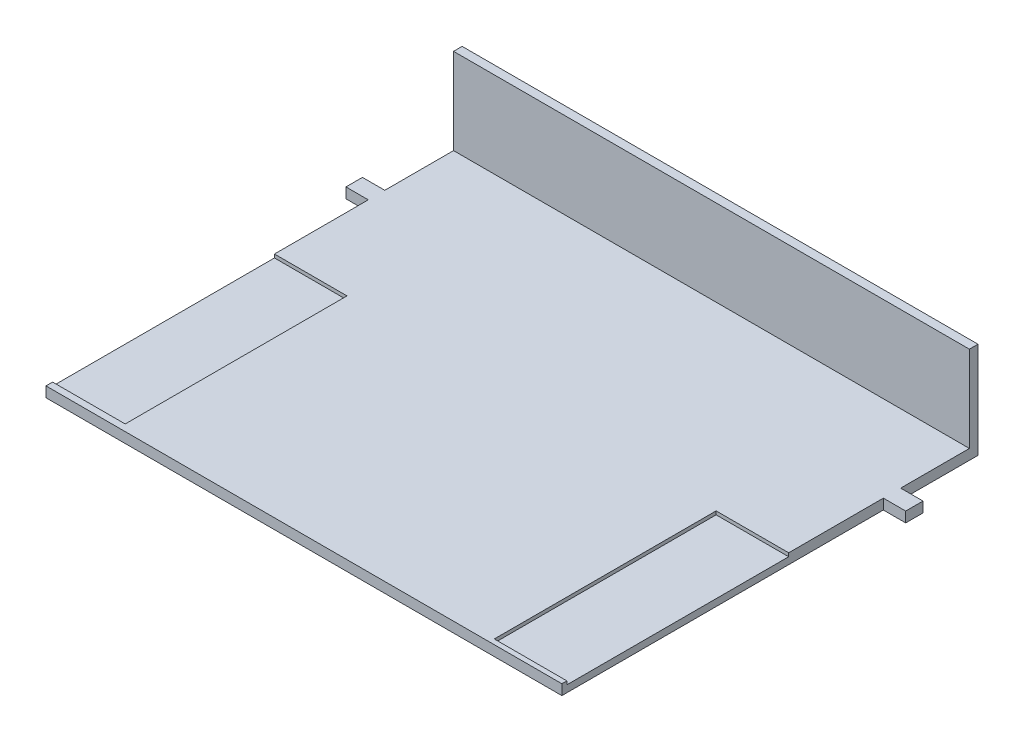
ISO-10303-21;
HEADER;
FILE_DESCRIPTION(('STEP AP214'),'2;1');
FILE_NAME('part.step','',(''),(''),'','','');
FILE_SCHEMA(('AUTOMOTIVE_DESIGN { 1 0 10303 214 1 1 1 1 }'));
ENDSEC;
DATA;
#1=APPLICATION_CONTEXT('core data for automotive mechanical design processes');
#2=APPLICATION_PROTOCOL_DEFINITION('international standard','automotive_design',2000,#1);
#3=PRODUCT_CONTEXT('',#1,'mechanical');
#4=PRODUCT('Part','Part','',(#3));
#5=PRODUCT_RELATED_PRODUCT_CATEGORY('part','',(#4));
#6=PRODUCT_DEFINITION_FORMATION('','',#4);
#7=PRODUCT_DEFINITION_CONTEXT('part definition',#1,'design');
#8=PRODUCT_DEFINITION('design','',#6,#7);
#9=PRODUCT_DEFINITION_SHAPE('','',#8);
#10=(LENGTH_UNIT() NAMED_UNIT(*) SI_UNIT(.MILLI.,.METRE.));
#11=(NAMED_UNIT(*) PLANE_ANGLE_UNIT() SI_UNIT($,.RADIAN.));
#12=(NAMED_UNIT(*) SI_UNIT($,.STERADIAN.) SOLID_ANGLE_UNIT());
#13=UNCERTAINTY_MEASURE_WITH_UNIT(LENGTH_MEASURE(1.E-05),#10,'distance_accuracy_value','');
#14=(GEOMETRIC_REPRESENTATION_CONTEXT(3) GLOBAL_UNCERTAINTY_ASSIGNED_CONTEXT((#13)) GLOBAL_UNIT_ASSIGNED_CONTEXT((#10,
#11,#12)) REPRESENTATION_CONTEXT('',''));
#15=CARTESIAN_POINT('',(0.,0.,0.));
#16=DIRECTION('',(0.,0.,1.));
#17=DIRECTION('',(1.,0.,0.));
#18=AXIS2_PLACEMENT_3D('',#15,#16,#17);
#19=CARTESIAN_POINT('',(0.,3.,121.));
#20=DIRECTION('',(0.,1.,0.));
#21=DIRECTION('',(0.,0.,1.));
#22=AXIS2_PLACEMENT_3D('',#19,#20,#21);
#23=PLANE('',#22);
#24=DIRECTION('',(0.,0.,-1.));
#25=VECTOR('',#24,1.);
#26=CARTESIAN_POINT('',(150.,3.,121.));
#27=LINE('',#26,#25);
#28=CARTESIAN_POINT('',(150.,3.,22.4873306391878));
#29=VERTEX_POINT('',#28);
#30=CARTESIAN_POINT('',(150.,3.,2.5));
#31=VERTEX_POINT('',#30);
#32=EDGE_CURVE('E326',#29,#31,#27,.T.);
#33=ORIENTED_EDGE('',*,*,#32,.T.);
#34=DIRECTION('',(-1.,0.,0.));
#35=VECTOR('',#34,1.);
#36=CARTESIAN_POINT('',(150.,3.,2.5));
#37=LINE('',#36,#35);
#38=CARTESIAN_POINT('',(0.,3.,2.5));
#39=VERTEX_POINT('',#38);
#40=EDGE_CURVE('E205',#31,#39,#37,.T.);
#41=ORIENTED_EDGE('',*,*,#40,.T.);
#42=DIRECTION('',(0.,0.,-1.));
#43=VECTOR('',#42,1.);
#44=CARTESIAN_POINT('',(0.,3.,121.));
#45=LINE('',#44,#43);
#46=CARTESIAN_POINT('',(0.,3.,22.4873306391878));
#47=VERTEX_POINT('',#46);
#48=EDGE_CURVE('E43',#47,#39,#45,.T.);
#49=ORIENTED_EDGE('',*,*,#48,.F.);
#50=DIRECTION('',(-1.,0.,0.));
#51=VECTOR('',#50,1.);
#52=CARTESIAN_POINT('',(0.,3.,22.4873306391878));
#53=LINE('',#52,#51);
#54=CARTESIAN_POINT('',(-6.5,3.,22.4873306391878));
#55=VERTEX_POINT('',#54);
#56=EDGE_CURVE('E238',#47,#55,#53,.T.);
#57=ORIENTED_EDGE('',*,*,#56,.T.);
#58=DIRECTION('',(0.,0.,1.));
#59=VECTOR('',#58,1.);
#60=CARTESIAN_POINT('',(-6.5,3.,22.4873306391878));
#61=LINE('',#60,#59);
#62=CARTESIAN_POINT('',(-6.5,3.,27.2873306391878));
#63=VERTEX_POINT('',#62);
#64=EDGE_CURVE('E241',#55,#63,#61,.T.);
#65=ORIENTED_EDGE('',*,*,#64,.T.);
#66=DIRECTION('',(1.,0.,0.));
#67=VECTOR('',#66,1.);
#68=CARTESIAN_POINT('',(-6.5,3.,27.2873306391878));
#69=LINE('',#68,#67);
#70=CARTESIAN_POINT('',(0.,3.,27.2873306391878));
#71=VERTEX_POINT('',#70);
#72=EDGE_CURVE('E236',#63,#71,#69,.T.);
#73=ORIENTED_EDGE('',*,*,#72,.T.);
#74=CARTESIAN_POINT('',(0.,3.,54.5746612783755));
#75=VERTEX_POINT('',#74);
#76=EDGE_CURVE('E41',#75,#71,#45,.T.);
#77=ORIENTED_EDGE('',*,*,#76,.F.);
#78=DIRECTION('',(-1.,0.,0.));
#79=VECTOR('',#78,1.);
#80=CARTESIAN_POINT('',(21.1,3.,54.5746612783755));
#81=LINE('',#80,#79);
#82=CARTESIAN_POINT('',(21.1,3.,54.5746612783755));
#83=VERTEX_POINT('',#82);
#84=EDGE_CURVE('E281',#83,#75,#81,.T.);
#85=ORIENTED_EDGE('',*,*,#84,.F.);
#86=DIRECTION('',(0.,0.,-1.));
#87=VECTOR('',#86,1.);
#88=CARTESIAN_POINT('',(21.1,3.,119.074661278376));
#89=LINE('',#88,#87);
#90=CARTESIAN_POINT('',(21.1,3.,119.074661278376));
#91=VERTEX_POINT('',#90);
#92=EDGE_CURVE('E290',#91,#83,#89,.T.);
#93=ORIENTED_EDGE('',*,*,#92,.F.);
#94=DIRECTION('',(1.,0.,0.));
#95=VECTOR('',#94,1.);
#96=CARTESIAN_POINT('',(0.,3.,119.074661278376));
#97=LINE('',#96,#95);
#98=CARTESIAN_POINT('',(0.,3.,119.074661278376));
#99=VERTEX_POINT('',#98);
#100=EDGE_CURVE('E301',#99,#91,#97,.T.);
#101=ORIENTED_EDGE('',*,*,#100,.F.);
#102=CARTESIAN_POINT('',(0.,3.,121.));
#103=VERTEX_POINT('',#102);
#104=EDGE_CURVE('E11',#103,#99,#45,.T.);
#105=ORIENTED_EDGE('',*,*,#104,.F.);
#106=DIRECTION('',(1.,0.,0.));
#107=VECTOR('',#106,1.);
#108=CARTESIAN_POINT('',(0.,3.,121.));
#109=LINE('',#108,#107);
#110=CARTESIAN_POINT('',(150.,3.,121.));
#111=VERTEX_POINT('',#110);
#112=EDGE_CURVE('E315',#103,#111,#109,.T.);
#113=ORIENTED_EDGE('',*,*,#112,.T.);
#114=CARTESIAN_POINT('',(150.,3.,119.548299377698));
#115=VERTEX_POINT('',#114);
#116=EDGE_CURVE('E36',#111,#115,#27,.T.);
#117=ORIENTED_EDGE('',*,*,#116,.T.);
#118=DIRECTION('',(1.,0.,0.));
#119=VECTOR('',#118,1.);
#120=CARTESIAN_POINT('',(150.,3.,119.548299377698));
#121=LINE('',#120,#119);
#122=CARTESIAN_POINT('',(128.9,3.,119.548299377698));
#123=VERTEX_POINT('',#122);
#124=EDGE_CURVE('E263',#123,#115,#121,.T.);
#125=ORIENTED_EDGE('',*,*,#124,.F.);
#126=DIRECTION('',(0.,0.,1.));
#127=VECTOR('',#126,1.);
#128=CARTESIAN_POINT('',(128.9,3.,119.548299377698));
#129=LINE('',#128,#127);
#130=CARTESIAN_POINT('',(128.9,3.,55.0482993776977));
#131=VERTEX_POINT('',#130);
#132=EDGE_CURVE('E274',#131,#123,#129,.T.);
#133=ORIENTED_EDGE('',*,*,#132,.F.);
#134=DIRECTION('',(-1.,0.,0.));
#135=VECTOR('',#134,1.);
#136=CARTESIAN_POINT('',(128.9,3.,55.0482993776977));
#137=LINE('',#136,#135);
#138=CARTESIAN_POINT('',(150.,3.,55.0482993776977));
#139=VERTEX_POINT('',#138);
#140=EDGE_CURVE('E258',#139,#131,#137,.T.);
#141=ORIENTED_EDGE('',*,*,#140,.F.);
#142=CARTESIAN_POINT('',(150.,3.,27.5241496888489));
#143=VERTEX_POINT('',#142);
#144=EDGE_CURVE('E345',#139,#143,#27,.T.);
#145=ORIENTED_EDGE('',*,*,#144,.T.);
#146=DIRECTION('',(1.,0.,0.));
#147=VECTOR('',#146,1.);
#148=CARTESIAN_POINT('',(150.,3.,27.5241496888489));
#149=LINE('',#148,#147);
#150=CARTESIAN_POINT('',(156.5,3.,27.5241496888489));
#151=VERTEX_POINT('',#150);
#152=EDGE_CURVE('E58',#143,#151,#149,.T.);
#153=ORIENTED_EDGE('',*,*,#152,.T.);
#154=DIRECTION('',(0.,0.,-1.));
#155=VECTOR('',#154,1.);
#156=CARTESIAN_POINT('',(156.5,3.,27.5241496888489));
#157=LINE('',#156,#155);
#158=CARTESIAN_POINT('',(156.5,3.,22.4873306391878));
#159=VERTEX_POINT('',#158);
#160=EDGE_CURVE('E216',#151,#159,#157,.T.);
#161=ORIENTED_EDGE('',*,*,#160,.T.);
#162=DIRECTION('',(-1.,0.,0.));
#163=VECTOR('',#162,1.);
#164=CARTESIAN_POINT('',(156.5,3.,22.4873306391878));
#165=LINE('',#164,#163);
#166=EDGE_CURVE('E211',#159,#29,#165,.T.);
#167=ORIENTED_EDGE('',*,*,#166,.T.);
#168=EDGE_LOOP('',(#33,#41,#49,#57,#65,#73,#77,#85,#93,#101,#105,#113,#117,#125,#133,#141,#145,
#153,#161,#167));
#169=FACE_BOUND('',#168,.T.);
#170=ADVANCED_FACE('F33',(#169),#23,.T.);
#171=CARTESIAN_POINT('',(150.,0.,121.));
#172=DIRECTION('',(-1.,0.,0.));
#173=DIRECTION('',(0.,0.,1.));
#174=AXIS2_PLACEMENT_3D('',#171,#172,#173);
#175=PLANE('',#174);
#176=DIRECTION('',(0.,1.,0.));
#177=VECTOR('',#176,1.);
#178=CARTESIAN_POINT('',(150.,0.,22.4873306391878));
#179=LINE('',#178,#177);
#180=CARTESIAN_POINT('',(150.,0.,22.4873306391878));
#181=VERTEX_POINT('',#180);
#182=EDGE_CURVE('E222',#181,#29,#179,.T.);
#183=ORIENTED_EDGE('',*,*,#182,.F.);
#184=DIRECTION('',(0.,0.,-1.));
#185=VECTOR('',#184,1.);
#186=CARTESIAN_POINT('',(150.,0.,121.));
#187=LINE('',#186,#185);
#188=CARTESIAN_POINT('',(150.,0.,0.));
#189=VERTEX_POINT('',#188);
#190=EDGE_CURVE('E337',#181,#189,#187,.T.);
#191=ORIENTED_EDGE('',*,*,#190,.T.);
#192=DIRECTION('',(0.,1.,0.));
#193=VECTOR('',#192,1.);
#194=CARTESIAN_POINT('',(150.,0.,0.));
#195=LINE('',#194,#193);
#196=CARTESIAN_POINT('',(150.,28.,0.));
#197=VERTEX_POINT('',#196);
#198=EDGE_CURVE('E308',#189,#197,#195,.T.);
#199=ORIENTED_EDGE('',*,*,#198,.T.);
#200=DIRECTION('',(0.,0.,-1.));
#201=VECTOR('',#200,1.);
#202=CARTESIAN_POINT('',(150.,28.,2.5));
#203=LINE('',#202,#201);
#204=CARTESIAN_POINT('',(150.,28.,2.5));
#205=VERTEX_POINT('',#204);
#206=EDGE_CURVE('E195',#205,#197,#203,.T.);
#207=ORIENTED_EDGE('',*,*,#206,.F.);
#208=DIRECTION('',(0.,-1.,0.));
#209=VECTOR('',#208,1.);
#210=CARTESIAN_POINT('',(150.,3.,2.5));
#211=LINE('',#210,#209);
#212=EDGE_CURVE('E196',#205,#31,#211,.T.);
#213=ORIENTED_EDGE('',*,*,#212,.T.);
#214=ORIENTED_EDGE('',*,*,#32,.F.);
#215=EDGE_LOOP('',(#183,#191,#199,#207,#213,#214));
#216=FACE_BOUND('',#215,.T.);
#217=ADVANCED_FACE('F353',(#216),#175,.F.);
#218=CARTESIAN_POINT('',(0.,0.,121.));
#219=DIRECTION('',(-1.,0.,0.));
#220=DIRECTION('',(0.,0.,1.));
#221=AXIS2_PLACEMENT_3D('',#218,#219,#220);
#222=PLANE('',#221);
#223=ORIENTED_EDGE('',*,*,#76,.T.);
#224=DIRECTION('',(0.,-1.,0.));
#225=VECTOR('',#224,1.);
#226=CARTESIAN_POINT('',(0.,3.,27.2873306391878));
#227=LINE('',#226,#225);
#228=CARTESIAN_POINT('',(0.,0.,27.2873306391878));
#229=VERTEX_POINT('',#228);
#230=EDGE_CURVE('E255',#71,#229,#227,.T.);
#231=ORIENTED_EDGE('',*,*,#230,.T.);
#232=DIRECTION('',(0.,0.,-1.));
#233=VECTOR('',#232,1.);
#234=CARTESIAN_POINT('',(0.,0.,121.));
#235=LINE('',#234,#233);
#236=CARTESIAN_POINT('',(0.,0.,121.));
#237=VERTEX_POINT('',#236);
#238=EDGE_CURVE('E332',#237,#229,#235,.T.);
#239=ORIENTED_EDGE('',*,*,#238,.F.);
#240=DIRECTION('',(0.,1.,0.));
#241=VECTOR('',#240,1.);
#242=CARTESIAN_POINT('',(0.,0.,121.));
#243=LINE('',#242,#241);
#244=EDGE_CURVE('E323',#237,#103,#243,.T.);
#245=ORIENTED_EDGE('',*,*,#244,.T.);
#246=ORIENTED_EDGE('',*,*,#104,.T.);
#247=DIRECTION('',(0.,1.,0.));
#248=VECTOR('',#247,1.);
#249=CARTESIAN_POINT('',(0.,2.,119.074661278376));
#250=LINE('',#249,#248);
#251=CARTESIAN_POINT('',(0.,2.,119.074661278376));
#252=VERTEX_POINT('',#251);
#253=EDGE_CURVE('E311',#252,#99,#250,.T.);
#254=ORIENTED_EDGE('',*,*,#253,.F.);
#255=DIRECTION('',(0.,0.,1.));
#256=VECTOR('',#255,1.);
#257=CARTESIAN_POINT('',(0.,2.,54.5746612783755));
#258=LINE('',#257,#256);
#259=CARTESIAN_POINT('',(0.,2.,54.5746612783755));
#260=VERTEX_POINT('',#259);
#261=EDGE_CURVE('E289',#260,#252,#258,.T.);
#262=ORIENTED_EDGE('',*,*,#261,.F.);
#263=DIRECTION('',(0.,1.,0.));
#264=VECTOR('',#263,1.);
#265=CARTESIAN_POINT('',(0.,2.,54.5746612783755));
#266=LINE('',#265,#264);
#267=EDGE_CURVE('E299',#260,#75,#266,.T.);
#268=ORIENTED_EDGE('',*,*,#267,.T.);
#269=EDGE_LOOP('',(#223,#231,#239,#245,#246,#254,#262,#268));
#270=FACE_BOUND('',#269,.T.);
#271=ADVANCED_FACE('F376',(#270),#222,.T.);
#272=DIRECTION('',(0.,-1.,0.));
#273=VECTOR('',#272,1.);
#274=CARTESIAN_POINT('',(0.,3.,22.4873306391878));
#275=LINE('',#274,#273);
#276=CARTESIAN_POINT('',(0.,0.,22.4873306391878));
#277=VERTEX_POINT('',#276);
#278=EDGE_CURVE('E253',#47,#277,#275,.T.);
#279=ORIENTED_EDGE('',*,*,#278,.F.);
#280=ORIENTED_EDGE('',*,*,#48,.T.);
#281=DIRECTION('',(0.,1.,0.));
#282=VECTOR('',#281,1.);
#283=CARTESIAN_POINT('',(0.,28.,2.5));
#284=LINE('',#283,#282);
#285=CARTESIAN_POINT('',(0.,28.,2.5));
#286=VERTEX_POINT('',#285);
#287=EDGE_CURVE('E50',#39,#286,#284,.T.);
#288=ORIENTED_EDGE('',*,*,#287,.T.);
#289=DIRECTION('',(0.,0.,-1.));
#290=VECTOR('',#289,1.);
#291=CARTESIAN_POINT('',(0.,28.,2.5));
#292=LINE('',#291,#290);
#293=CARTESIAN_POINT('',(0.,28.,0.));
#294=VERTEX_POINT('',#293);
#295=EDGE_CURVE('E186',#286,#294,#292,.T.);
#296=ORIENTED_EDGE('',*,*,#295,.T.);
#297=DIRECTION('',(0.,1.,0.));
#298=VECTOR('',#297,1.);
#299=CARTESIAN_POINT('',(0.,0.,0.));
#300=LINE('',#299,#298);
#301=CARTESIAN_POINT('',(0.,0.,0.));
#302=VERTEX_POINT('',#301);
#303=EDGE_CURVE('E319',#302,#294,#300,.T.);
#304=ORIENTED_EDGE('',*,*,#303,.F.);
#305=EDGE_CURVE('E334',#277,#302,#235,.T.);
#306=ORIENTED_EDGE('',*,*,#305,.F.);
#307=EDGE_LOOP('',(#279,#280,#288,#296,#304,#306));
#308=FACE_BOUND('',#307,.T.);
#309=ADVANCED_FACE('F203',(#308),#222,.T.);
#310=CARTESIAN_POINT('',(0.,0.,121.));
#311=DIRECTION('',(0.,1.,0.));
#312=DIRECTION('',(0.,0.,1.));
#313=AXIS2_PLACEMENT_3D('',#310,#311,#312);
#314=PLANE('',#313);
#315=DIRECTION('',(1.,0.,0.));
#316=VECTOR('',#315,1.);
#317=CARTESIAN_POINT('',(0.,0.,0.));
#318=LINE('',#317,#316);
#319=EDGE_CURVE('E328',#302,#189,#318,.T.);
#320=ORIENTED_EDGE('',*,*,#319,.T.);
#321=ORIENTED_EDGE('',*,*,#190,.F.);
#322=DIRECTION('',(-1.,0.,0.));
#323=VECTOR('',#322,1.);
#324=CARTESIAN_POINT('',(156.5,0.,22.4873306391878));
#325=LINE('',#324,#323);
#326=CARTESIAN_POINT('',(156.5,0.,22.4873306391878));
#327=VERTEX_POINT('',#326);
#328=EDGE_CURVE('E213',#327,#181,#325,.T.);
#329=ORIENTED_EDGE('',*,*,#328,.F.);
#330=DIRECTION('',(0.,0.,-1.));
#331=VECTOR('',#330,1.);
#332=CARTESIAN_POINT('',(156.5,0.,27.5241496888489));
#333=LINE('',#332,#331);
#334=CARTESIAN_POINT('',(156.5,0.,27.5241496888489));
#335=VERTEX_POINT('',#334);
#336=EDGE_CURVE('E219',#335,#327,#333,.T.);
#337=ORIENTED_EDGE('',*,*,#336,.F.);
#338=DIRECTION('',(1.,0.,0.));
#339=VECTOR('',#338,1.);
#340=CARTESIAN_POINT('',(150.,0.,27.5241496888489));
#341=LINE('',#340,#339);
#342=CARTESIAN_POINT('',(150.,0.,27.5241496888489));
#343=VERTEX_POINT('',#342);
#344=EDGE_CURVE('E215',#343,#335,#341,.T.);
#345=ORIENTED_EDGE('',*,*,#344,.F.);
#346=CARTESIAN_POINT('',(150.,0.,121.));
#347=VERTEX_POINT('',#346);
#348=EDGE_CURVE('E335',#347,#343,#187,.T.);
#349=ORIENTED_EDGE('',*,*,#348,.F.);
#350=DIRECTION('',(1.,0.,0.));
#351=VECTOR('',#350,1.);
#352=CARTESIAN_POINT('',(0.,0.,121.));
#353=LINE('',#352,#351);
#354=EDGE_CURVE('E321',#237,#347,#353,.T.);
#355=ORIENTED_EDGE('',*,*,#354,.F.);
#356=ORIENTED_EDGE('',*,*,#238,.T.);
#357=DIRECTION('',(1.,0.,0.));
#358=VECTOR('',#357,1.);
#359=CARTESIAN_POINT('',(-6.5,0.,27.2873306391878));
#360=LINE('',#359,#358);
#361=CARTESIAN_POINT('',(-6.5,0.,27.2873306391878));
#362=VERTEX_POINT('',#361);
#363=EDGE_CURVE('E230',#362,#229,#360,.T.);
#364=ORIENTED_EDGE('',*,*,#363,.F.);
#365=DIRECTION('',(0.,0.,1.));
#366=VECTOR('',#365,1.);
#367=CARTESIAN_POINT('',(-6.5,0.,22.4873306391878));
#368=LINE('',#367,#366);
#369=CARTESIAN_POINT('',(-6.5,0.,22.4873306391878));
#370=VERTEX_POINT('',#369);
#371=EDGE_CURVE('E239',#370,#362,#368,.T.);
#372=ORIENTED_EDGE('',*,*,#371,.F.);
#373=DIRECTION('',(-1.,0.,0.));
#374=VECTOR('',#373,1.);
#375=CARTESIAN_POINT('',(0.,0.,22.4873306391878));
#376=LINE('',#375,#374);
#377=EDGE_CURVE('E245',#277,#370,#376,.T.);
#378=ORIENTED_EDGE('',*,*,#377,.F.);
#379=ORIENTED_EDGE('',*,*,#305,.T.);
#380=EDGE_LOOP('',(#320,#321,#329,#337,#345,#349,#355,#356,#364,#372,#378,#379));
#381=FACE_BOUND('',#380,.T.);
#382=ADVANCED_FACE('F361',(#381),#314,.F.);
#383=ORIENTED_EDGE('',*,*,#348,.T.);
#384=DIRECTION('',(0.,1.,0.));
#385=VECTOR('',#384,1.);
#386=CARTESIAN_POINT('',(150.,0.,27.5241496888489));
#387=LINE('',#386,#385);
#388=EDGE_CURVE('E233',#343,#143,#387,.T.);
#389=ORIENTED_EDGE('',*,*,#388,.T.);
#390=ORIENTED_EDGE('',*,*,#144,.F.);
#391=DIRECTION('',(0.,1.,0.));
#392=VECTOR('',#391,1.);
#393=CARTESIAN_POINT('',(150.,2.,55.0482993776977));
#394=LINE('',#393,#392);
#395=CARTESIAN_POINT('',(150.,2.,55.0482993776977));
#396=VERTEX_POINT('',#395);
#397=EDGE_CURVE('E271',#396,#139,#394,.T.);
#398=ORIENTED_EDGE('',*,*,#397,.F.);
#399=DIRECTION('',(0.,0.,-1.));
#400=VECTOR('',#399,1.);
#401=CARTESIAN_POINT('',(150.,2.,119.548299377698));
#402=LINE('',#401,#400);
#403=CARTESIAN_POINT('',(150.,2.,119.548299377698));
#404=VERTEX_POINT('',#403);
#405=EDGE_CURVE('E259',#404,#396,#402,.T.);
#406=ORIENTED_EDGE('',*,*,#405,.F.);
#407=DIRECTION('',(0.,1.,0.));
#408=VECTOR('',#407,1.);
#409=CARTESIAN_POINT('',(150.,2.,119.548299377698));
#410=LINE('',#409,#408);
#411=EDGE_CURVE('E278',#404,#115,#410,.T.);
#412=ORIENTED_EDGE('',*,*,#411,.T.);
#413=ORIENTED_EDGE('',*,*,#116,.F.);
#414=DIRECTION('',(0.,1.,0.));
#415=VECTOR('',#414,1.);
#416=CARTESIAN_POINT('',(150.,0.,121.));
#417=LINE('',#416,#415);
#418=EDGE_CURVE('E318',#347,#111,#417,.T.);
#419=ORIENTED_EDGE('',*,*,#418,.F.);
#420=EDGE_LOOP('',(#383,#389,#390,#398,#406,#412,#413,#419));
#421=FACE_BOUND('',#420,.T.);
#422=ADVANCED_FACE('F396',(#421),#175,.F.);
#423=CARTESIAN_POINT('',(0.,0.,121.));
#424=DIRECTION('',(0.,0.,1.));
#425=DIRECTION('',(1.,0.,0.));
#426=AXIS2_PLACEMENT_3D('',#423,#424,#425);
#427=PLANE('',#426);
#428=ORIENTED_EDGE('',*,*,#112,.F.);
#429=ORIENTED_EDGE('',*,*,#244,.F.);
#430=ORIENTED_EDGE('',*,*,#354,.T.);
#431=ORIENTED_EDGE('',*,*,#418,.T.);
#432=EDGE_LOOP('',(#428,#429,#430,#431));
#433=FACE_BOUND('',#432,.T.);
#434=ADVANCED_FACE('F395',(#433),#427,.T.);
#435=CARTESIAN_POINT('',(0.,0.,0.));
#436=DIRECTION('',(0.,0.,1.));
#437=DIRECTION('',(1.,0.,0.));
#438=AXIS2_PLACEMENT_3D('',#435,#436,#437);
#439=PLANE('',#438);
#440=ORIENTED_EDGE('',*,*,#303,.T.);
#441=DIRECTION('',(1.,0.,0.));
#442=VECTOR('',#441,1.);
#443=CARTESIAN_POINT('',(150.,28.,0.));
#444=LINE('',#443,#442);
#445=EDGE_CURVE('E192',#294,#197,#444,.T.);
#446=ORIENTED_EDGE('',*,*,#445,.T.);
#447=ORIENTED_EDGE('',*,*,#198,.F.);
#448=ORIENTED_EDGE('',*,*,#319,.F.);
#449=EDGE_LOOP('',(#440,#446,#447,#448));
#450=FACE_BOUND('',#449,.T.);
#451=ADVANCED_FACE('F356',(#450),#439,.F.);
#452=CARTESIAN_POINT('',(21.1,2.,54.5746612783755));
#453=DIRECTION('',(0.,0.,-1.));
#454=DIRECTION('',(-1.,0.,0.));
#455=AXIS2_PLACEMENT_3D('',#452,#453,#454);
#456=PLANE('',#455);
#457=ORIENTED_EDGE('',*,*,#84,.T.);
#458=ORIENTED_EDGE('',*,*,#267,.F.);
#459=DIRECTION('',(-1.,0.,0.));
#460=VECTOR('',#459,1.);
#461=CARTESIAN_POINT('',(21.1,2.,54.5746612783755));
#462=LINE('',#461,#460);
#463=CARTESIAN_POINT('',(21.1,2.,54.5746612783755));
#464=VERTEX_POINT('',#463);
#465=EDGE_CURVE('E287',#464,#260,#462,.T.);
#466=ORIENTED_EDGE('',*,*,#465,.F.);
#467=DIRECTION('',(0.,1.,0.));
#468=VECTOR('',#467,1.);
#469=CARTESIAN_POINT('',(21.1,2.,54.5746612783755));
#470=LINE('',#469,#468);
#471=EDGE_CURVE('E306',#464,#83,#470,.T.);
#472=ORIENTED_EDGE('',*,*,#471,.T.);
#473=EDGE_LOOP('',(#457,#458,#466,#472));
#474=FACE_BOUND('',#473,.T.);
#475=ADVANCED_FACE('F383',(#474),#456,.F.);
#476=CARTESIAN_POINT('',(21.1,2.,119.074661278376));
#477=DIRECTION('',(1.,0.,0.));
#478=DIRECTION('',(0.,0.,-1.));
#479=AXIS2_PLACEMENT_3D('',#476,#477,#478);
#480=PLANE('',#479);
#481=ORIENTED_EDGE('',*,*,#92,.T.);
#482=ORIENTED_EDGE('',*,*,#471,.F.);
#483=DIRECTION('',(0.,0.,-1.));
#484=VECTOR('',#483,1.);
#485=CARTESIAN_POINT('',(21.1,2.,119.074661278376));
#486=LINE('',#485,#484);
#487=CARTESIAN_POINT('',(21.1,2.,119.074661278376));
#488=VERTEX_POINT('',#487);
#489=EDGE_CURVE('E296',#488,#464,#486,.T.);
#490=ORIENTED_EDGE('',*,*,#489,.F.);
#491=DIRECTION('',(0.,1.,0.));
#492=VECTOR('',#491,1.);
#493=CARTESIAN_POINT('',(21.1,2.,119.074661278376));
#494=LINE('',#493,#492);
#495=EDGE_CURVE('E309',#488,#91,#494,.T.);
#496=ORIENTED_EDGE('',*,*,#495,.T.);
#497=EDGE_LOOP('',(#481,#482,#490,#496));
#498=FACE_BOUND('',#497,.T.);
#499=ADVANCED_FACE('F387',(#498),#480,.F.);
#500=CARTESIAN_POINT('',(0.,2.,119.074661278376));
#501=DIRECTION('',(0.,0.,1.));
#502=DIRECTION('',(1.,0.,0.));
#503=AXIS2_PLACEMENT_3D('',#500,#501,#502);
#504=PLANE('',#503);
#505=ORIENTED_EDGE('',*,*,#100,.T.);
#506=ORIENTED_EDGE('',*,*,#495,.F.);
#507=DIRECTION('',(1.,0.,0.));
#508=VECTOR('',#507,1.);
#509=CARTESIAN_POINT('',(0.,2.,119.074661278376));
#510=LINE('',#509,#508);
#511=EDGE_CURVE('E293',#252,#488,#510,.T.);
#512=ORIENTED_EDGE('',*,*,#511,.F.);
#513=ORIENTED_EDGE('',*,*,#253,.T.);
#514=EDGE_LOOP('',(#505,#506,#512,#513));
#515=FACE_BOUND('',#514,.T.);
#516=ADVANCED_FACE('F389',(#515),#504,.F.);
#517=CARTESIAN_POINT('',(0.,2.,0.));
#518=DIRECTION('',(0.,1.,0.));
#519=DIRECTION('',(0.,0.,1.));
#520=AXIS2_PLACEMENT_3D('',#517,#518,#519);
#521=PLANE('',#520);
#522=ORIENTED_EDGE('',*,*,#465,.T.);
#523=ORIENTED_EDGE('',*,*,#261,.T.);
#524=ORIENTED_EDGE('',*,*,#511,.T.);
#525=ORIENTED_EDGE('',*,*,#489,.T.);
#526=EDGE_LOOP('',(#522,#523,#524,#525));
#527=FACE_BOUND('',#526,.T.);
#528=ADVANCED_FACE('F454',(#527),#521,.T.);
#529=CARTESIAN_POINT('',(150.,2.,119.548299377698));
#530=DIRECTION('',(0.,0.,1.));
#531=DIRECTION('',(1.,0.,0.));
#532=AXIS2_PLACEMENT_3D('',#529,#530,#531);
#533=PLANE('',#532);
#534=ORIENTED_EDGE('',*,*,#124,.T.);
#535=ORIENTED_EDGE('',*,*,#411,.F.);
#536=DIRECTION('',(1.,0.,0.));
#537=VECTOR('',#536,1.);
#538=CARTESIAN_POINT('',(150.,2.,119.548299377698));
#539=LINE('',#538,#537);
#540=CARTESIAN_POINT('',(128.9,2.,119.548299377698));
#541=VERTEX_POINT('',#540);
#542=EDGE_CURVE('E269',#541,#404,#539,.T.);
#543=ORIENTED_EDGE('',*,*,#542,.F.);
#544=DIRECTION('',(0.,1.,0.));
#545=VECTOR('',#544,1.);
#546=CARTESIAN_POINT('',(128.9,2.,119.548299377698));
#547=LINE('',#546,#545);
#548=EDGE_CURVE('E282',#541,#123,#547,.T.);
#549=ORIENTED_EDGE('',*,*,#548,.T.);
#550=EDGE_LOOP('',(#534,#535,#543,#549));
#551=FACE_BOUND('',#550,.T.);
#552=ADVANCED_FACE('F402',(#551),#533,.F.);
#553=CARTESIAN_POINT('',(128.9,2.,119.548299377698));
#554=DIRECTION('',(-1.,0.,0.));
#555=DIRECTION('',(0.,0.,1.));
#556=AXIS2_PLACEMENT_3D('',#553,#554,#555);
#557=PLANE('',#556);
#558=ORIENTED_EDGE('',*,*,#132,.T.);
#559=ORIENTED_EDGE('',*,*,#548,.F.);
#560=DIRECTION('',(0.,0.,1.));
#561=VECTOR('',#560,1.);
#562=CARTESIAN_POINT('',(128.9,2.,119.548299377698));
#563=LINE('',#562,#561);
#564=CARTESIAN_POINT('',(128.9,2.,55.0482993776977));
#565=VERTEX_POINT('',#564);
#566=EDGE_CURVE('E266',#565,#541,#563,.T.);
#567=ORIENTED_EDGE('',*,*,#566,.F.);
#568=DIRECTION('',(0.,1.,0.));
#569=VECTOR('',#568,1.);
#570=CARTESIAN_POINT('',(128.9,2.,55.0482993776977));
#571=LINE('',#570,#569);
#572=EDGE_CURVE('E284',#565,#131,#571,.T.);
#573=ORIENTED_EDGE('',*,*,#572,.T.);
#574=EDGE_LOOP('',(#558,#559,#567,#573));
#575=FACE_BOUND('',#574,.T.);
#576=ADVANCED_FACE('F407',(#575),#557,.F.);
#577=CARTESIAN_POINT('',(128.9,2.,55.0482993776977));
#578=DIRECTION('',(0.,0.,-1.));
#579=DIRECTION('',(-1.,0.,0.));
#580=AXIS2_PLACEMENT_3D('',#577,#578,#579);
#581=PLANE('',#580);
#582=ORIENTED_EDGE('',*,*,#140,.T.);
#583=ORIENTED_EDGE('',*,*,#572,.F.);
#584=DIRECTION('',(-1.,0.,0.));
#585=VECTOR('',#584,1.);
#586=CARTESIAN_POINT('',(128.9,2.,55.0482993776977));
#587=LINE('',#586,#585);
#588=EDGE_CURVE('E262',#396,#565,#587,.T.);
#589=ORIENTED_EDGE('',*,*,#588,.F.);
#590=ORIENTED_EDGE('',*,*,#397,.T.);
#591=EDGE_LOOP('',(#582,#583,#589,#590));
#592=FACE_BOUND('',#591,.T.);
#593=ADVANCED_FACE('F410',(#592),#581,.F.);
#594=CARTESIAN_POINT('',(0.,2.,0.));
#595=DIRECTION('',(0.,-1.,0.));
#596=DIRECTION('',(0.,0.,-1.));
#597=AXIS2_PLACEMENT_3D('',#594,#595,#596);
#598=PLANE('',#597);
#599=ORIENTED_EDGE('',*,*,#405,.T.);
#600=ORIENTED_EDGE('',*,*,#588,.T.);
#601=ORIENTED_EDGE('',*,*,#566,.T.);
#602=ORIENTED_EDGE('',*,*,#542,.T.);
#603=EDGE_LOOP('',(#599,#600,#601,#602));
#604=FACE_BOUND('',#603,.T.);
#605=ADVANCED_FACE('F462',(#604),#598,.F.);
#606=CARTESIAN_POINT('',(-6.5,3.,27.2873306391878));
#607=DIRECTION('',(0.,0.,-1.));
#608=DIRECTION('',(-1.,0.,0.));
#609=AXIS2_PLACEMENT_3D('',#606,#607,#608);
#610=PLANE('',#609);
#611=ORIENTED_EDGE('',*,*,#363,.T.);
#612=ORIENTED_EDGE('',*,*,#230,.F.);
#613=ORIENTED_EDGE('',*,*,#72,.F.);
#614=DIRECTION('',(0.,-1.,0.));
#615=VECTOR('',#614,1.);
#616=CARTESIAN_POINT('',(-6.5,3.,27.2873306391878));
#617=LINE('',#616,#615);
#618=EDGE_CURVE('E243',#63,#362,#617,.T.);
#619=ORIENTED_EDGE('',*,*,#618,.T.);
#620=EDGE_LOOP('',(#611,#612,#613,#619));
#621=FACE_BOUND('',#620,.T.);
#622=ADVANCED_FACE('F469',(#621),#610,.F.);
#623=CARTESIAN_POINT('',(0.,3.,22.4873306391878));
#624=DIRECTION('',(0.,0.,1.));
#625=DIRECTION('',(1.,0.,0.));
#626=AXIS2_PLACEMENT_3D('',#623,#624,#625);
#627=PLANE('',#626);
#628=ORIENTED_EDGE('',*,*,#377,.T.);
#629=DIRECTION('',(0.,-1.,0.));
#630=VECTOR('',#629,1.);
#631=CARTESIAN_POINT('',(-6.5,3.,22.4873306391878));
#632=LINE('',#631,#630);
#633=EDGE_CURVE('E250',#55,#370,#632,.T.);
#634=ORIENTED_EDGE('',*,*,#633,.F.);
#635=ORIENTED_EDGE('',*,*,#56,.F.);
#636=ORIENTED_EDGE('',*,*,#278,.T.);
#637=EDGE_LOOP('',(#628,#634,#635,#636));
#638=FACE_BOUND('',#637,.T.);
#639=ADVANCED_FACE('F366',(#638),#627,.F.);
#640=CARTESIAN_POINT('',(-6.5,3.,22.4873306391878));
#641=DIRECTION('',(1.,0.,0.));
#642=DIRECTION('',(0.,0.,-1.));
#643=AXIS2_PLACEMENT_3D('',#640,#641,#642);
#644=PLANE('',#643);
#645=ORIENTED_EDGE('',*,*,#371,.T.);
#646=ORIENTED_EDGE('',*,*,#618,.F.);
#647=ORIENTED_EDGE('',*,*,#64,.F.);
#648=ORIENTED_EDGE('',*,*,#633,.T.);
#649=EDGE_LOOP('',(#645,#646,#647,#648));
#650=FACE_BOUND('',#649,.T.);
#651=ADVANCED_FACE('F369',(#650),#644,.F.);
#652=CARTESIAN_POINT('',(156.5,0.,22.4873306391878));
#653=DIRECTION('',(0.,0.,-1.));
#654=DIRECTION('',(-1.,0.,0.));
#655=AXIS2_PLACEMENT_3D('',#652,#653,#654);
#656=PLANE('',#655);
#657=ORIENTED_EDGE('',*,*,#166,.F.);
#658=DIRECTION('',(0.,1.,0.));
#659=VECTOR('',#658,1.);
#660=CARTESIAN_POINT('',(156.5,0.,22.4873306391878));
#661=LINE('',#660,#659);
#662=EDGE_CURVE('E228',#327,#159,#661,.T.);
#663=ORIENTED_EDGE('',*,*,#662,.F.);
#664=ORIENTED_EDGE('',*,*,#328,.T.);
#665=ORIENTED_EDGE('',*,*,#182,.T.);
#666=EDGE_LOOP('',(#657,#663,#664,#665));
#667=FACE_BOUND('',#666,.T.);
#668=ADVANCED_FACE('F417',(#667),#656,.T.);
#669=CARTESIAN_POINT('',(156.5,0.,27.5241496888489));
#670=DIRECTION('',(1.,0.,0.));
#671=DIRECTION('',(0.,0.,-1.));
#672=AXIS2_PLACEMENT_3D('',#669,#670,#671);
#673=PLANE('',#672);
#674=ORIENTED_EDGE('',*,*,#160,.F.);
#675=DIRECTION('',(0.,1.,0.));
#676=VECTOR('',#675,1.);
#677=CARTESIAN_POINT('',(156.5,0.,27.5241496888489));
#678=LINE('',#677,#676);
#679=EDGE_CURVE('E231',#335,#151,#678,.T.);
#680=ORIENTED_EDGE('',*,*,#679,.F.);
#681=ORIENTED_EDGE('',*,*,#336,.T.);
#682=ORIENTED_EDGE('',*,*,#662,.T.);
#683=EDGE_LOOP('',(#674,#680,#681,#682));
#684=FACE_BOUND('',#683,.T.);
#685=ADVANCED_FACE('F413',(#684),#673,.T.);
#686=CARTESIAN_POINT('',(150.,0.,27.5241496888489));
#687=DIRECTION('',(0.,0.,1.));
#688=DIRECTION('',(1.,0.,0.));
#689=AXIS2_PLACEMENT_3D('',#686,#687,#688);
#690=PLANE('',#689);
#691=ORIENTED_EDGE('',*,*,#152,.F.);
#692=ORIENTED_EDGE('',*,*,#388,.F.);
#693=ORIENTED_EDGE('',*,*,#344,.T.);
#694=ORIENTED_EDGE('',*,*,#679,.T.);
#695=EDGE_LOOP('',(#691,#692,#693,#694));
#696=FACE_BOUND('',#695,.T.);
#697=ADVANCED_FACE('F419',(#696),#690,.T.);
#698=CARTESIAN_POINT('',(150.,28.,2.5));
#699=DIRECTION('',(0.,1.,0.));
#700=DIRECTION('',(0.,0.,1.));
#701=AXIS2_PLACEMENT_3D('',#698,#699,#700);
#702=PLANE('',#701);
#703=ORIENTED_EDGE('',*,*,#445,.F.);
#704=ORIENTED_EDGE('',*,*,#295,.F.);
#705=DIRECTION('',(1.,0.,0.));
#706=VECTOR('',#705,1.);
#707=CARTESIAN_POINT('',(150.,28.,2.5));
#708=LINE('',#707,#706);
#709=EDGE_CURVE('E189',#286,#205,#708,.T.);
#710=ORIENTED_EDGE('',*,*,#709,.T.);
#711=ORIENTED_EDGE('',*,*,#206,.T.);
#712=EDGE_LOOP('',(#703,#704,#710,#711));
#713=FACE_BOUND('',#712,.T.);
#714=ADVANCED_FACE('F187',(#713),#702,.T.);
#715=CARTESIAN_POINT('',(0.,0.,2.5));
#716=DIRECTION('',(0.,0.,1.));
#717=DIRECTION('',(1.,0.,0.));
#718=AXIS2_PLACEMENT_3D('',#715,#716,#717);
#719=PLANE('',#718);
#720=ORIENTED_EDGE('',*,*,#40,.F.);
#721=ORIENTED_EDGE('',*,*,#212,.F.);
#722=ORIENTED_EDGE('',*,*,#709,.F.);
#723=ORIENTED_EDGE('',*,*,#287,.F.);
#724=EDGE_LOOP('',(#720,#721,#722,#723));
#725=FACE_BOUND('',#724,.T.);
#726=ADVANCED_FACE('F198',(#725),#719,.T.);
#727=CLOSED_SHELL('',(#170,#217,#271,#309,#382,#422,#434,#451,#475,#499,#516,#528,#552,#576,
#593,#605,#622,#639,#651,#668,#685,#697,#714,#726));
#728=MANIFOLD_SOLID_BREP('B2',#727);
#729=ADVANCED_BREP_SHAPE_REPRESENTATION('',(#18,#728),#14);
#730=SHAPE_DEFINITION_REPRESENTATION(#9,#729);
ENDSEC;
END-ISO-10303-21;
